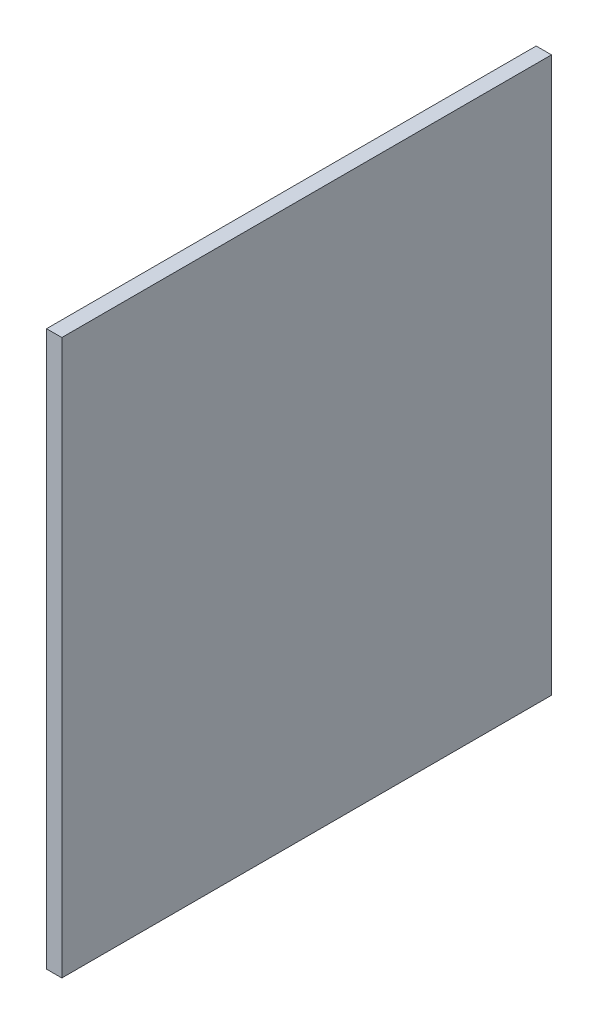
ISO-10303-21;
HEADER;
FILE_DESCRIPTION(('STEP AP214'),'2;1');
FILE_NAME('part.step','',(''),(''),'','','');
FILE_SCHEMA(('AUTOMOTIVE_DESIGN { 1 0 10303 214 1 1 1 1 }'));
ENDSEC;
DATA;
#1=APPLICATION_CONTEXT('core data for automotive mechanical design processes');
#2=APPLICATION_PROTOCOL_DEFINITION('international standard','automotive_design',2000,#1);
#3=PRODUCT_CONTEXT('',#1,'mechanical');
#4=PRODUCT('Part','Part','',(#3));
#5=PRODUCT_RELATED_PRODUCT_CATEGORY('part','',(#4));
#6=PRODUCT_DEFINITION_FORMATION('','',#4);
#7=PRODUCT_DEFINITION_CONTEXT('part definition',#1,'design');
#8=PRODUCT_DEFINITION('design','',#6,#7);
#9=PRODUCT_DEFINITION_SHAPE('','',#8);
#10=(LENGTH_UNIT() NAMED_UNIT(*) SI_UNIT(.MILLI.,.METRE.));
#11=(NAMED_UNIT(*) PLANE_ANGLE_UNIT() SI_UNIT($,.RADIAN.));
#12=(NAMED_UNIT(*) SI_UNIT($,.STERADIAN.) SOLID_ANGLE_UNIT());
#13=UNCERTAINTY_MEASURE_WITH_UNIT(LENGTH_MEASURE(1.E-05),#10,'distance_accuracy_value','');
#14=(GEOMETRIC_REPRESENTATION_CONTEXT(3) GLOBAL_UNCERTAINTY_ASSIGNED_CONTEXT((#13)) GLOBAL_UNIT_ASSIGNED_CONTEXT((#10,
#11,#12)) REPRESENTATION_CONTEXT('',''));
#15=CARTESIAN_POINT('',(0.,0.,0.));
#16=DIRECTION('',(0.,0.,1.));
#17=DIRECTION('',(1.,0.,0.));
#18=AXIS2_PLACEMENT_3D('',#15,#16,#17);
#19=CARTESIAN_POINT('',(40.,508.850931677018,756.521739130435));
#20=DIRECTION('',(0.,0.,-1.));
#21=DIRECTION('',(-1.,0.,0.));
#22=AXIS2_PLACEMENT_3D('',#19,#20,#21);
#23=PLANE('',#22);
#24=DIRECTION('',(0.,-1.,0.));
#25=VECTOR('',#24,1.);
#26=CARTESIAN_POINT('',(0.,508.850931677018,756.521739130435));
#27=LINE('',#26,#25);
#28=CARTESIAN_POINT('',(0.,508.850931677018,756.521739130435));
#29=VERTEX_POINT('',#28);
#30=CARTESIAN_POINT('',(0.,-941.149068322982,756.521739130435));
#31=VERTEX_POINT('',#30);
#32=EDGE_CURVE('E107',#29,#31,#27,.T.);
#33=ORIENTED_EDGE('',*,*,#32,.T.);
#34=DIRECTION('',(-1.,0.,0.));
#35=VECTOR('',#34,1.);
#36=CARTESIAN_POINT('',(40.,-941.149068322982,756.521739130435));
#37=LINE('',#36,#35);
#38=CARTESIAN_POINT('',(40.,-941.149068322982,756.521739130435));
#39=VERTEX_POINT('',#38);
#40=EDGE_CURVE('E11',#39,#31,#37,.T.);
#41=ORIENTED_EDGE('',*,*,#40,.F.);
#42=DIRECTION('',(0.,-1.,0.));
#43=VECTOR('',#42,1.);
#44=CARTESIAN_POINT('',(40.,508.850931677018,756.521739130435));
#45=LINE('',#44,#43);
#46=CARTESIAN_POINT('',(40.,508.850931677018,756.521739130435));
#47=VERTEX_POINT('',#46);
#48=EDGE_CURVE('E91',#47,#39,#45,.T.);
#49=ORIENTED_EDGE('',*,*,#48,.F.);
#50=DIRECTION('',(-1.,0.,0.));
#51=VECTOR('',#50,1.);
#52=CARTESIAN_POINT('',(40.,508.850931677018,756.521739130435));
#53=LINE('',#52,#51);
#54=EDGE_CURVE('E103',#47,#29,#53,.T.);
#55=ORIENTED_EDGE('',*,*,#54,.T.);
#56=EDGE_LOOP('',(#33,#41,#49,#55));
#57=FACE_BOUND('',#56,.T.);
#58=ADVANCED_FACE('F39',(#57),#23,.F.);
#59=CARTESIAN_POINT('',(40.,-941.149068322982,756.521739130435));
#60=DIRECTION('',(0.,1.,0.));
#61=DIRECTION('',(0.,0.,1.));
#62=AXIS2_PLACEMENT_3D('',#59,#60,#61);
#63=PLANE('',#62);
#64=DIRECTION('',(0.,0.,-1.));
#65=VECTOR('',#64,1.);
#66=CARTESIAN_POINT('',(0.,-941.149068322982,756.521739130435));
#67=LINE('',#66,#65);
#68=CARTESIAN_POINT('',(0.,-941.149068322982,-523.478260869565));
#69=VERTEX_POINT('',#68);
#70=EDGE_CURVE('E96',#31,#69,#67,.T.);
#71=ORIENTED_EDGE('',*,*,#70,.T.);
#72=DIRECTION('',(-1.,0.,0.));
#73=VECTOR('',#72,1.);
#74=CARTESIAN_POINT('',(40.,-941.149068322982,-523.478260869565));
#75=LINE('',#74,#73);
#76=CARTESIAN_POINT('',(40.,-941.149068322982,-523.478260869565));
#77=VERTEX_POINT('',#76);
#78=EDGE_CURVE('E48',#77,#69,#75,.T.);
#79=ORIENTED_EDGE('',*,*,#78,.F.);
#80=DIRECTION('',(0.,0.,-1.));
#81=VECTOR('',#80,1.);
#82=CARTESIAN_POINT('',(40.,-941.149068322982,756.521739130435));
#83=LINE('',#82,#81);
#84=EDGE_CURVE('E86',#39,#77,#83,.T.);
#85=ORIENTED_EDGE('',*,*,#84,.F.);
#86=ORIENTED_EDGE('',*,*,#40,.T.);
#87=EDGE_LOOP('',(#71,#79,#85,#86));
#88=FACE_BOUND('',#87,.T.);
#89=ADVANCED_FACE('F95',(#88),#63,.F.);
#90=CARTESIAN_POINT('',(40.,508.850931677018,-523.478260869565));
#91=DIRECTION('',(0.,0.,1.));
#92=DIRECTION('',(1.,0.,0.));
#93=AXIS2_PLACEMENT_3D('',#90,#91,#92);
#94=PLANE('',#93);
#95=DIRECTION('',(0.,1.,0.));
#96=VECTOR('',#95,1.);
#97=CARTESIAN_POINT('',(0.,508.850931677018,-523.478260869565));
#98=LINE('',#97,#96);
#99=CARTESIAN_POINT('',(0.,508.850931677018,-523.478260869565));
#100=VERTEX_POINT('',#99);
#101=EDGE_CURVE('E73',#69,#100,#98,.T.);
#102=ORIENTED_EDGE('',*,*,#101,.T.);
#103=DIRECTION('',(-1.,0.,0.));
#104=VECTOR('',#103,1.);
#105=CARTESIAN_POINT('',(40.,508.850931677018,-523.478260869565));
#106=LINE('',#105,#104);
#107=CARTESIAN_POINT('',(40.,508.850931677018,-523.478260869565));
#108=VERTEX_POINT('',#107);
#109=EDGE_CURVE('E98',#108,#100,#106,.T.);
#110=ORIENTED_EDGE('',*,*,#109,.F.);
#111=DIRECTION('',(0.,1.,0.));
#112=VECTOR('',#111,1.);
#113=CARTESIAN_POINT('',(40.,508.850931677018,-523.478260869565));
#114=LINE('',#113,#112);
#115=EDGE_CURVE('E89',#77,#108,#114,.T.);
#116=ORIENTED_EDGE('',*,*,#115,.F.);
#117=ORIENTED_EDGE('',*,*,#78,.T.);
#118=EDGE_LOOP('',(#102,#110,#116,#117));
#119=FACE_BOUND('',#118,.T.);
#120=ADVANCED_FACE('F99',(#119),#94,.F.);
#121=CARTESIAN_POINT('',(40.,508.850931677018,756.521739130435));
#122=DIRECTION('',(0.,-1.,0.));
#123=DIRECTION('',(0.,0.,-1.));
#124=AXIS2_PLACEMENT_3D('',#121,#122,#123);
#125=PLANE('',#124);
#126=DIRECTION('',(0.,0.,1.));
#127=VECTOR('',#126,1.);
#128=CARTESIAN_POINT('',(0.,508.850931677018,756.521739130435));
#129=LINE('',#128,#127);
#130=EDGE_CURVE('E79',#100,#29,#129,.T.);
#131=ORIENTED_EDGE('',*,*,#130,.T.);
#132=ORIENTED_EDGE('',*,*,#54,.F.);
#133=DIRECTION('',(0.,0.,1.));
#134=VECTOR('',#133,1.);
#135=CARTESIAN_POINT('',(40.,508.850931677018,756.521739130435));
#136=LINE('',#135,#134);
#137=EDGE_CURVE('E56',#108,#47,#136,.T.);
#138=ORIENTED_EDGE('',*,*,#137,.F.);
#139=ORIENTED_EDGE('',*,*,#109,.T.);
#140=EDGE_LOOP('',(#131,#132,#138,#139));
#141=FACE_BOUND('',#140,.T.);
#142=ADVANCED_FACE('F120',(#141),#125,.F.);
#143=CARTESIAN_POINT('',(40.,0.,0.));
#144=DIRECTION('',(1.,0.,0.));
#145=DIRECTION('',(0.,0.,-1.));
#146=AXIS2_PLACEMENT_3D('',#143,#144,#145);
#147=PLANE('',#146);
#148=ORIENTED_EDGE('',*,*,#48,.T.);
#149=ORIENTED_EDGE('',*,*,#84,.T.);
#150=ORIENTED_EDGE('',*,*,#115,.T.);
#151=ORIENTED_EDGE('',*,*,#137,.T.);
#152=EDGE_LOOP('',(#148,#149,#150,#151));
#153=FACE_BOUND('',#152,.T.);
#154=ADVANCED_FACE('F87',(#153),#147,.T.);
#155=CARTESIAN_POINT('',(0.,0.,0.));
#156=DIRECTION('',(1.,0.,0.));
#157=DIRECTION('',(0.,0.,-1.));
#158=AXIS2_PLACEMENT_3D('',#155,#156,#157);
#159=PLANE('',#158);
#160=ORIENTED_EDGE('',*,*,#32,.F.);
#161=ORIENTED_EDGE('',*,*,#130,.F.);
#162=ORIENTED_EDGE('',*,*,#101,.F.);
#163=ORIENTED_EDGE('',*,*,#70,.F.);
#164=EDGE_LOOP('',(#160,#161,#162,#163));
#165=FACE_BOUND('',#164,.T.);
#166=ADVANCED_FACE('F123',(#165),#159,.F.);
#167=CLOSED_SHELL('',(#58,#89,#120,#142,#154,#166));
#168=MANIFOLD_SOLID_BREP('B2',#167);
#169=ADVANCED_BREP_SHAPE_REPRESENTATION('',(#18,#168),#14);
#170=SHAPE_DEFINITION_REPRESENTATION(#9,#169);
ENDSEC;
END-ISO-10303-21;
